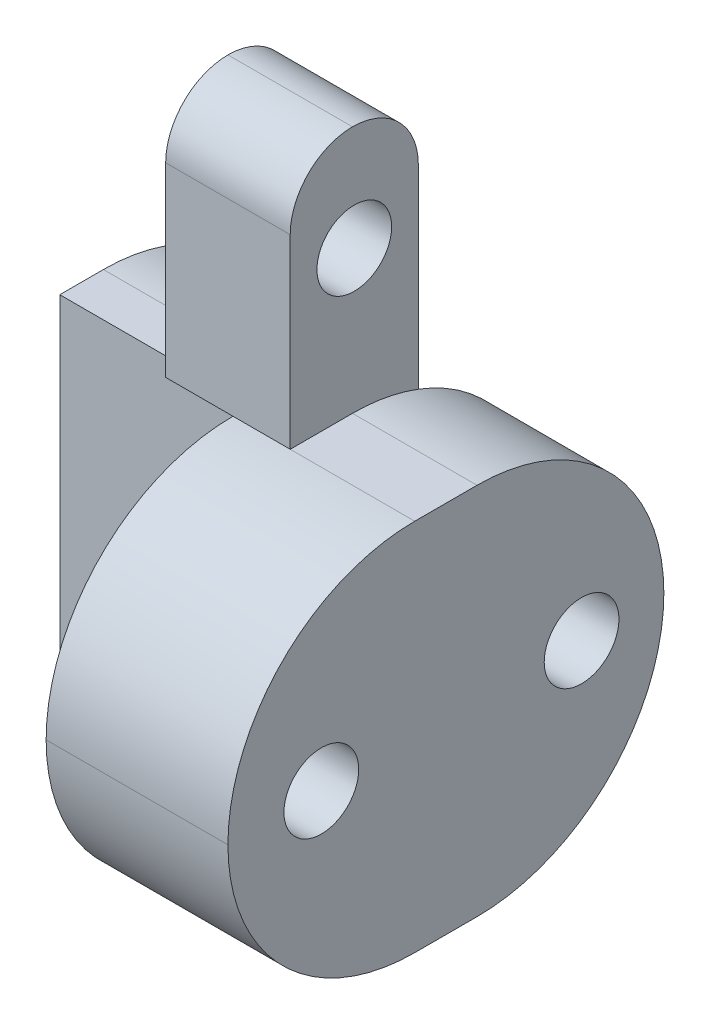
ISO-10303-21;
HEADER;
FILE_DESCRIPTION(('STEP AP214'),'2;1');
FILE_NAME('part.step','',(''),(''),'','','');
FILE_SCHEMA(('AUTOMOTIVE_DESIGN { 1 0 10303 214 1 1 1 1 }'));
ENDSEC;
DATA;
#1=APPLICATION_CONTEXT('core data for automotive mechanical design processes');
#2=APPLICATION_PROTOCOL_DEFINITION('international standard','automotive_design',2000,#1);
#3=PRODUCT_CONTEXT('',#1,'mechanical');
#4=PRODUCT('Part','Part','',(#3));
#5=PRODUCT_RELATED_PRODUCT_CATEGORY('part','',(#4));
#6=PRODUCT_DEFINITION_FORMATION('','',#4);
#7=PRODUCT_DEFINITION_CONTEXT('part definition',#1,'design');
#8=PRODUCT_DEFINITION('design','',#6,#7);
#9=PRODUCT_DEFINITION_SHAPE('','',#8);
#10=(LENGTH_UNIT() NAMED_UNIT(*) SI_UNIT(.MILLI.,.METRE.));
#11=(NAMED_UNIT(*) PLANE_ANGLE_UNIT() SI_UNIT($,.RADIAN.));
#12=(NAMED_UNIT(*) SI_UNIT($,.STERADIAN.) SOLID_ANGLE_UNIT());
#13=UNCERTAINTY_MEASURE_WITH_UNIT(LENGTH_MEASURE(1.E-05),#10,'distance_accuracy_value','');
#14=(GEOMETRIC_REPRESENTATION_CONTEXT(3) GLOBAL_UNCERTAINTY_ASSIGNED_CONTEXT((#13)) GLOBAL_UNIT_ASSIGNED_CONTEXT((#10,
#11,#12)) REPRESENTATION_CONTEXT('',''));
#15=CARTESIAN_POINT('',(0.,0.,0.));
#16=DIRECTION('',(0.,0.,1.));
#17=DIRECTION('',(1.,0.,0.));
#18=AXIS2_PLACEMENT_3D('',#15,#16,#17);
#19=CARTESIAN_POINT('',(0.,30.,0.));
#20=DIRECTION('',(0.,1.,0.));
#21=DIRECTION('',(0.,0.,1.));
#22=AXIS2_PLACEMENT_3D('',#19,#20,#21);
#23=PLANE('',#22);
#24=DIRECTION('',(-1.,0.,0.));
#25=VECTOR('',#24,1.);
#26=CARTESIAN_POINT('',(-0.00827647710685379,30.,-16.5));
#27=LINE('',#26,#25);
#28=CARTESIAN_POINT('',(-5.40449846696377,30.,-16.5));
#29=VERTEX_POINT('',#28);
#30=CARTESIAN_POINT('',(-15.4044984669638,30.,-16.5));
#31=VERTEX_POINT('',#30);
#32=EDGE_CURVE('E180',#29,#31,#27,.T.);
#33=ORIENTED_EDGE('',*,*,#32,.F.);
#34=DIRECTION('',(0.,0.,1.));
#35=VECTOR('',#34,1.);
#36=CARTESIAN_POINT('',(-5.40449846696377,30.,-25.2884975646309));
#37=LINE('',#36,#35);
#38=CARTESIAN_POINT('',(-5.40449846696377,30.,-20.));
#39=VERTEX_POINT('',#38);
#40=EDGE_CURVE('E219',#39,#29,#37,.T.);
#41=ORIENTED_EDGE('',*,*,#40,.F.);
#42=DIRECTION('',(-1.,0.,0.));
#43=VECTOR('',#42,1.);
#44=CARTESIAN_POINT('',(-15.4044984669638,30.,-20.));
#45=LINE('',#44,#43);
#46=CARTESIAN_POINT('',(-15.4044984669638,30.,-20.));
#47=VERTEX_POINT('',#46);
#48=EDGE_CURVE('E374',#39,#47,#45,.T.);
#49=ORIENTED_EDGE('',*,*,#48,.T.);
#50=DIRECTION('',(0.,0.,1.));
#51=VECTOR('',#50,1.);
#52=CARTESIAN_POINT('',(-15.4044984669638,30.,-35.));
#53=LINE('',#52,#51);
#54=EDGE_CURVE('E255',#47,#31,#53,.T.);
#55=ORIENTED_EDGE('',*,*,#54,.T.);
#56=EDGE_LOOP('',(#33,#41,#49,#55));
#57=FACE_BOUND('',#56,.T.);
#58=ADVANCED_FACE('F43',(#57),#23,.T.);
#59=DIRECTION('',(0.,0.,-1.));
#60=VECTOR('',#59,1.);
#61=CARTESIAN_POINT('',(14.5955015330362,30.,0.));
#62=LINE('',#61,#60);
#63=CARTESIAN_POINT('',(14.5955015330362,30.,-15.));
#64=VERTEX_POINT('',#63);
#65=CARTESIAN_POINT('',(14.5955015330362,30.,-20.));
#66=VERTEX_POINT('',#65);
#67=EDGE_CURVE('E251',#64,#66,#62,.T.);
#68=ORIENTED_EDGE('',*,*,#67,.T.);
#69=DIRECTION('',(-1.,0.,0.));
#70=VECTOR('',#69,1.);
#71=CARTESIAN_POINT('',(4.59550153303623,30.,-20.));
#72=LINE('',#71,#70);
#73=CARTESIAN_POINT('',(4.59550153303623,30.,-20.));
#74=VERTEX_POINT('',#73);
#75=EDGE_CURVE('E340',#66,#74,#72,.T.);
#76=ORIENTED_EDGE('',*,*,#75,.T.);
#77=DIRECTION('',(0.,0.,-1.));
#78=VECTOR('',#77,1.);
#79=CARTESIAN_POINT('',(4.59550153303623,30.,-15.));
#80=LINE('',#79,#78);
#81=CARTESIAN_POINT('',(4.59550153303623,30.,-15.));
#82=VERTEX_POINT('',#81);
#83=EDGE_CURVE('E222',#82,#74,#80,.T.);
#84=ORIENTED_EDGE('',*,*,#83,.F.);
#85=DIRECTION('',(1.,0.,0.));
#86=VECTOR('',#85,1.);
#87=CARTESIAN_POINT('',(14.5955015330362,30.,-15.));
#88=LINE('',#87,#86);
#89=EDGE_CURVE('E283',#82,#64,#88,.T.);
#90=ORIENTED_EDGE('',*,*,#89,.T.);
#91=EDGE_LOOP('',(#68,#76,#84,#90));
#92=FACE_BOUND('',#91,.T.);
#93=ADVANCED_FACE('F429',(#92),#23,.T.);
#94=CARTESIAN_POINT('',(0.,30.,-15.));
#95=DIRECTION('',(1.,0.,0.));
#96=DIRECTION('',(0.,0.,-1.));
#97=AXIS2_PLACEMENT_3D('',#94,#95,#96);
#98=PLANE('',#97);
#99=CARTESIAN_POINT('',(0.,15.,-7.5));
#100=DIRECTION('',(-1.,0.,0.));
#101=DIRECTION('',(0.,0.,1.));
#102=AXIS2_PLACEMENT_3D('',#99,#100,#101);
#103=CIRCLE('',#102,3.);
#104=CARTESIAN_POINT('',(0.,15.,-4.5));
#105=VERTEX_POINT('',#104);
#106=EDGE_CURVE('E246',#105,#105,#103,.T.);
#107=ORIENTED_EDGE('',*,*,#106,.F.);
#108=EDGE_LOOP('',(#107));
#109=FACE_BOUND('',#108,.T.);
#110=DIRECTION('',(0.,-1.,0.));
#111=VECTOR('',#110,1.);
#112=CARTESIAN_POINT('',(0.,30.,-15.));
#113=LINE('',#112,#111);
#114=CARTESIAN_POINT('',(0.,30.,-15.));
#115=VERTEX_POINT('',#114);
#116=CARTESIAN_POINT('',(0.,0.,-15.));
#117=VERTEX_POINT('',#116);
#118=EDGE_CURVE('E260',#115,#117,#113,.T.);
#119=ORIENTED_EDGE('',*,*,#118,.T.);
#120=CARTESIAN_POINT('',(0.,15.,-15.));
#121=DIRECTION('',(1.,0.,0.));
#122=DIRECTION('',(0.,0.,-1.));
#123=AXIS2_PLACEMENT_3D('',#120,#121,#122);
#124=CIRCLE('',#123,15.);
#125=CARTESIAN_POINT('',(0.,15.,0.));
#126=VERTEX_POINT('',#125);
#127=EDGE_CURVE('E309',#117,#126,#124,.F.);
#128=ORIENTED_EDGE('',*,*,#127,.T.);
#129=CARTESIAN_POINT('',(0.,15.,-15.));
#130=DIRECTION('',(1.,0.,0.));
#131=DIRECTION('',(0.,0.,-1.));
#132=AXIS2_PLACEMENT_3D('',#129,#130,#131);
#133=CIRCLE('',#132,15.);
#134=EDGE_CURVE('E299',#126,#115,#133,.F.);
#135=ORIENTED_EDGE('',*,*,#134,.T.);
#136=EDGE_LOOP('',(#119,#128,#135));
#137=FACE_BOUND('',#136,.T.);
#138=ADVANCED_FACE('F449',(#109,#137),#98,.F.);
#139=CARTESIAN_POINT('',(14.5955015330362,30.,0.));
#140=DIRECTION('',(-1.,0.,0.));
#141=DIRECTION('',(0.,0.,1.));
#142=AXIS2_PLACEMENT_3D('',#139,#140,#141);
#143=PLANE('',#142);
#144=CARTESIAN_POINT('',(14.5955015330362,15.,-28.3939454519953));
#145=DIRECTION('',(-1.,0.,0.));
#146=DIRECTION('',(0.,0.,1.));
#147=AXIS2_PLACEMENT_3D('',#144,#145,#146);
#148=CIRCLE('',#147,2.99999999999999);
#149=CARTESIAN_POINT('',(14.5955015330362,15.,-25.3939454519953));
#150=VERTEX_POINT('',#149);
#151=EDGE_CURVE('E242',#150,#150,#148,.F.);
#152=ORIENTED_EDGE('',*,*,#151,.F.);
#153=EDGE_LOOP('',(#152));
#154=FACE_BOUND('',#153,.T.);
#155=CARTESIAN_POINT('',(14.5955015330362,15.,-7.5));
#156=DIRECTION('',(-1.,0.,0.));
#157=DIRECTION('',(0.,0.,1.));
#158=AXIS2_PLACEMENT_3D('',#155,#156,#157);
#159=CIRCLE('',#158,3.);
#160=CARTESIAN_POINT('',(14.5955015330362,15.,-4.5));
#161=VERTEX_POINT('',#160);
#162=EDGE_CURVE('E250',#161,#161,#159,.T.);
#163=ORIENTED_EDGE('',*,*,#162,.T.);
#164=EDGE_LOOP('',(#163));
#165=FACE_BOUND('',#164,.T.);
#166=CARTESIAN_POINT('',(14.5955015330362,15.,-20.));
#167=DIRECTION('',(-1.,0.,0.));
#168=DIRECTION('',(0.,0.,1.));
#169=AXIS2_PLACEMENT_3D('',#166,#167,#168);
#170=CIRCLE('',#169,15.);
#171=CARTESIAN_POINT('',(14.5955015330362,0.,-20.));
#172=VERTEX_POINT('',#171);
#173=CARTESIAN_POINT('',(14.5955015330362,15.,-35.));
#174=VERTEX_POINT('',#173);
#175=EDGE_CURVE('E354',#172,#174,#170,.F.);
#176=ORIENTED_EDGE('',*,*,#175,.T.);
#177=CARTESIAN_POINT('',(14.5955015330362,15.,-20.));
#178=DIRECTION('',(-1.,0.,0.));
#179=DIRECTION('',(0.,0.,1.));
#180=AXIS2_PLACEMENT_3D('',#177,#178,#179);
#181=CIRCLE('',#180,15.);
#182=EDGE_CURVE('E357',#174,#66,#181,.F.);
#183=ORIENTED_EDGE('',*,*,#182,.T.);
#184=ORIENTED_EDGE('',*,*,#67,.F.);
#185=CARTESIAN_POINT('',(14.5955015330362,15.,-15.));
#186=DIRECTION('',(-1.,0.,0.));
#187=DIRECTION('',(0.,0.,1.));
#188=AXIS2_PLACEMENT_3D('',#185,#186,#187);
#189=CIRCLE('',#188,15.);
#190=CARTESIAN_POINT('',(14.5955015330362,15.,0.));
#191=VERTEX_POINT('',#190);
#192=EDGE_CURVE('E291',#64,#191,#189,.F.);
#193=ORIENTED_EDGE('',*,*,#192,.T.);
#194=CARTESIAN_POINT('',(14.5955015330362,15.,-15.));
#195=DIRECTION('',(-1.,0.,0.));
#196=DIRECTION('',(0.,0.,1.));
#197=AXIS2_PLACEMENT_3D('',#194,#195,#196);
#198=CIRCLE('',#197,15.);
#199=CARTESIAN_POINT('',(14.5955015330362,0.,-15.));
#200=VERTEX_POINT('',#199);
#201=EDGE_CURVE('E302',#191,#200,#198,.F.);
#202=ORIENTED_EDGE('',*,*,#201,.T.);
#203=DIRECTION('',(0.,0.,-1.));
#204=VECTOR('',#203,1.);
#205=CARTESIAN_POINT('',(14.5955015330362,0.,0.));
#206=LINE('',#205,#204);
#207=EDGE_CURVE('E261',#200,#172,#206,.T.);
#208=ORIENTED_EDGE('',*,*,#207,.T.);
#209=EDGE_LOOP('',(#176,#183,#184,#193,#202,#208));
#210=FACE_BOUND('',#209,.T.);
#211=ADVANCED_FACE('F427',(#154,#165,#210),#143,.F.);
#212=CARTESIAN_POINT('',(4.59550153303623,30.,-35.));
#213=DIRECTION('',(1.,0.,0.));
#214=DIRECTION('',(0.,0.,-1.));
#215=AXIS2_PLACEMENT_3D('',#212,#213,#214);
#216=PLANE('',#215);
#217=CARTESIAN_POINT('',(4.59550153303623,15.,-28.3939454519953));
#218=DIRECTION('',(1.,0.,0.));
#219=DIRECTION('',(0.,0.,-1.));
#220=AXIS2_PLACEMENT_3D('',#217,#218,#219);
#221=CIRCLE('',#220,2.99999999999999);
#222=CARTESIAN_POINT('',(4.59550153303623,15.,-31.3939454519952));
#223=VERTEX_POINT('',#222);
#224=EDGE_CURVE('E238',#223,#223,#221,.F.);
#225=ORIENTED_EDGE('',*,*,#224,.F.);
#226=EDGE_LOOP('',(#225));
#227=FACE_BOUND('',#226,.T.);
#228=DIRECTION('',(0.,-1.,0.));
#229=VECTOR('',#228,1.);
#230=CARTESIAN_POINT('',(4.59550153303623,30.,-25.2884975646309));
#231=LINE('',#230,#229);
#232=CARTESIAN_POINT('',(4.59550153303623,29.0368013987836,-25.2884975646309));
#233=VERTEX_POINT('',#232);
#234=CARTESIAN_POINT('',(4.59550153303623,0.963198601216408,-25.2884975646309));
#235=VERTEX_POINT('',#234);
#236=EDGE_CURVE('E278',#233,#235,#231,.T.);
#237=ORIENTED_EDGE('',*,*,#236,.F.);
#238=CARTESIAN_POINT('',(4.59550153303623,15.,-20.));
#239=DIRECTION('',(1.,0.,0.));
#240=DIRECTION('',(0.,0.,-1.));
#241=AXIS2_PLACEMENT_3D('',#238,#239,#240);
#242=CIRCLE('',#241,15.);
#243=CARTESIAN_POINT('',(4.59550153303623,15.,-35.));
#244=VERTEX_POINT('',#243);
#245=EDGE_CURVE('E351',#233,#244,#242,.F.);
#246=ORIENTED_EDGE('',*,*,#245,.T.);
#247=CARTESIAN_POINT('',(4.59550153303623,15.,-20.));
#248=DIRECTION('',(1.,0.,0.));
#249=DIRECTION('',(0.,0.,-1.));
#250=AXIS2_PLACEMENT_3D('',#247,#248,#249);
#251=CIRCLE('',#250,15.);
#252=EDGE_CURVE('E347',#244,#235,#251,.F.);
#253=ORIENTED_EDGE('',*,*,#252,.T.);
#254=EDGE_LOOP('',(#237,#246,#253));
#255=FACE_BOUND('',#254,.T.);
#256=ADVANCED_FACE('F423',(#227,#255),#216,.F.);
#257=CARTESIAN_POINT('',(4.59550153303623,30.,-25.2884975646309));
#258=DIRECTION('',(0.,0.,1.));
#259=DIRECTION('',(1.,0.,0.));
#260=AXIS2_PLACEMENT_3D('',#257,#258,#259);
#261=PLANE('',#260);
#262=ORIENTED_EDGE('',*,*,#236,.T.);
#263=DIRECTION('',(-1.,0.,0.));
#264=VECTOR('',#263,1.);
#265=CARTESIAN_POINT('',(4.59550153303623,0.963198601216414,-25.2884975646309));
#266=LINE('',#265,#264);
#267=CARTESIAN_POINT('',(-5.40449846696377,0.963198601216412,-25.2884975646309));
#268=VERTEX_POINT('',#267);
#269=EDGE_CURVE('E344',#235,#268,#266,.T.);
#270=ORIENTED_EDGE('',*,*,#269,.T.);
#271=DIRECTION('',(0.,-1.,0.));
#272=VECTOR('',#271,1.);
#273=CARTESIAN_POINT('',(-5.40449846696377,30.,-25.2884975646309));
#274=LINE('',#273,#272);
#275=CARTESIAN_POINT('',(-5.40449846696377,29.0368013987836,-25.2884975646309));
#276=VERTEX_POINT('',#275);
#277=EDGE_CURVE('E274',#276,#268,#274,.T.);
#278=ORIENTED_EDGE('',*,*,#277,.F.);
#279=CARTESIAN_POINT('',(-5.40449846696377,44.6238003674185,-25.2884975646309));
#280=VERTEX_POINT('',#279);
#281=EDGE_CURVE('E275',#280,#276,#274,.T.);
#282=ORIENTED_EDGE('',*,*,#281,.F.);
#283=DIRECTION('',(1.,0.,0.));
#284=VECTOR('',#283,1.);
#285=CARTESIAN_POINT('',(4.59550153303623,44.6238003674185,-25.2884975646309));
#286=LINE('',#285,#284);
#287=CARTESIAN_POINT('',(4.59550153303623,44.6238003674185,-25.2884975646309));
#288=VERTEX_POINT('',#287);
#289=EDGE_CURVE('E333',#280,#288,#286,.T.);
#290=ORIENTED_EDGE('',*,*,#289,.T.);
#291=EDGE_CURVE('E279',#288,#233,#231,.T.);
#292=ORIENTED_EDGE('',*,*,#291,.T.);
#293=EDGE_LOOP('',(#262,#270,#278,#282,#290,#292));
#294=FACE_BOUND('',#293,.T.);
#295=ADVANCED_FACE('F398',(#294),#261,.F.);
#296=CARTESIAN_POINT('',(-5.40449846696377,30.,-25.2884975646309));
#297=DIRECTION('',(-1.,0.,0.));
#298=DIRECTION('',(0.,0.,1.));
#299=AXIS2_PLACEMENT_3D('',#296,#297,#298);
#300=PLANE('',#299);
#301=CARTESIAN_POINT('',(-5.40449846696377,15.,-28.3939454519953));
#302=DIRECTION('',(-1.,0.,0.));
#303=DIRECTION('',(0.,0.,1.));
#304=AXIS2_PLACEMENT_3D('',#301,#302,#303);
#305=CIRCLE('',#304,2.99999999999999);
#306=CARTESIAN_POINT('',(-5.40449846696377,15.,-25.3939454519953));
#307=VERTEX_POINT('',#306);
#308=EDGE_CURVE('E234',#307,#307,#305,.F.);
#309=ORIENTED_EDGE('',*,*,#308,.F.);
#310=EDGE_LOOP('',(#309));
#311=FACE_BOUND('',#310,.T.);
#312=ORIENTED_EDGE('',*,*,#277,.T.);
#313=CARTESIAN_POINT('',(-5.40449846696377,15.,-20.));
#314=DIRECTION('',(-1.,0.,0.));
#315=DIRECTION('',(0.,0.,1.));
#316=AXIS2_PLACEMENT_3D('',#313,#314,#315);
#317=CIRCLE('',#316,15.);
#318=CARTESIAN_POINT('',(-5.40449846696377,15.,-35.));
#319=VERTEX_POINT('',#318);
#320=EDGE_CURVE('E67',#268,#319,#317,.F.);
#321=ORIENTED_EDGE('',*,*,#320,.T.);
#322=CARTESIAN_POINT('',(-5.40449846696377,15.,-20.));
#323=DIRECTION('',(-1.,0.,0.));
#324=DIRECTION('',(0.,0.,1.));
#325=AXIS2_PLACEMENT_3D('',#322,#323,#324);
#326=CIRCLE('',#325,15.);
#327=EDGE_CURVE('E369',#319,#276,#326,.F.);
#328=ORIENTED_EDGE('',*,*,#327,.T.);
#329=EDGE_LOOP('',(#312,#321,#328));
#330=FACE_BOUND('',#329,.T.);
#331=ADVANCED_FACE('F395',(#311,#330),#300,.F.);
#332=CARTESIAN_POINT('',(-15.4044984669638,30.,-35.));
#333=DIRECTION('',(1.,0.,0.));
#334=DIRECTION('',(0.,0.,-1.));
#335=AXIS2_PLACEMENT_3D('',#332,#333,#334);
#336=PLANE('',#335);
#337=CARTESIAN_POINT('',(-15.4044984669638,15.,-28.3939454519952));
#338=DIRECTION('',(1.,0.,0.));
#339=DIRECTION('',(0.,0.,-1.));
#340=AXIS2_PLACEMENT_3D('',#337,#338,#339);
#341=CIRCLE('',#340,2.99999999999999);
#342=CARTESIAN_POINT('',(-15.4044984669638,15.,-31.3939454519952));
#343=VERTEX_POINT('',#342);
#344=EDGE_CURVE('E233',#343,#343,#341,.F.);
#345=ORIENTED_EDGE('',*,*,#344,.F.);
#346=EDGE_LOOP('',(#345));
#347=FACE_BOUND('',#346,.T.);
#348=DIRECTION('',(0.,0.,1.));
#349=VECTOR('',#348,1.);
#350=CARTESIAN_POINT('',(-15.4044984669638,0.,-35.));
#351=LINE('',#350,#349);
#352=CARTESIAN_POINT('',(-15.4044984669638,0.,-20.));
#353=VERTEX_POINT('',#352);
#354=CARTESIAN_POINT('',(-15.4044984669638,0.,-16.5));
#355=VERTEX_POINT('',#354);
#356=EDGE_CURVE('E265',#353,#355,#351,.T.);
#357=ORIENTED_EDGE('',*,*,#356,.T.);
#358=DIRECTION('',(0.,-1.,0.));
#359=VECTOR('',#358,1.);
#360=CARTESIAN_POINT('',(-15.4044984669638,0.,-16.5));
#361=LINE('',#360,#359);
#362=EDGE_CURVE('E196',#31,#355,#361,.T.);
#363=ORIENTED_EDGE('',*,*,#362,.F.);
#364=ORIENTED_EDGE('',*,*,#54,.F.);
#365=CARTESIAN_POINT('',(-15.4044984669638,15.,-20.));
#366=DIRECTION('',(1.,0.,0.));
#367=DIRECTION('',(0.,0.,-1.));
#368=AXIS2_PLACEMENT_3D('',#365,#366,#367);
#369=CIRCLE('',#368,15.);
#370=CARTESIAN_POINT('',(-15.4044984669638,15.,-35.));
#371=VERTEX_POINT('',#370);
#372=EDGE_CURVE('E363',#47,#371,#369,.F.);
#373=ORIENTED_EDGE('',*,*,#372,.T.);
#374=CARTESIAN_POINT('',(-15.4044984669638,15.,-20.));
#375=DIRECTION('',(1.,0.,0.));
#376=DIRECTION('',(0.,0.,-1.));
#377=AXIS2_PLACEMENT_3D('',#374,#375,#376);
#378=CIRCLE('',#377,15.);
#379=EDGE_CURVE('E366',#371,#353,#378,.F.);
#380=ORIENTED_EDGE('',*,*,#379,.T.);
#381=EDGE_LOOP('',(#357,#363,#364,#373,#380));
#382=FACE_BOUND('',#381,.T.);
#383=ADVANCED_FACE('F453',(#347,#382),#336,.F.);
#384=CARTESIAN_POINT('',(-15.4044984669638,30.,-15.));
#385=DIRECTION('',(0.,0.,-1.));
#386=DIRECTION('',(-1.,0.,0.));
#387=AXIS2_PLACEMENT_3D('',#384,#385,#386);
#388=PLANE('',#387);
#389=DIRECTION('',(0.,-1.,0.));
#390=VECTOR('',#389,1.);
#391=CARTESIAN_POINT('',(-5.40449846696377,49.9237878857039,-15.));
#392=LINE('',#391,#390);
#393=CARTESIAN_POINT('',(-5.40449846696377,44.9237878857039,-15.));
#394=VERTEX_POINT('',#393);
#395=CARTESIAN_POINT('',(-5.40449846696377,30.,-15.));
#396=VERTEX_POINT('',#395);
#397=EDGE_CURVE('E229',#394,#396,#392,.T.);
#398=ORIENTED_EDGE('',*,*,#397,.T.);
#399=DIRECTION('',(-1.,0.,0.));
#400=VECTOR('',#399,1.);
#401=CARTESIAN_POINT('',(-0.00827647710685379,30.,-15.));
#402=LINE('',#401,#400);
#403=CARTESIAN_POINT('',(-0.00827647710685379,30.,-15.));
#404=VERTEX_POINT('',#403);
#405=EDGE_CURVE('E205',#404,#396,#402,.T.);
#406=ORIENTED_EDGE('',*,*,#405,.F.);
#407=DIRECTION('',(0.,1.,0.));
#408=VECTOR('',#407,1.);
#409=CARTESIAN_POINT('',(-0.00827647710685379,30.,-15.));
#410=LINE('',#409,#408);
#411=CARTESIAN_POINT('',(-0.00827647710685379,0.,-14.9999999999998));
#412=VERTEX_POINT('',#411);
#413=EDGE_CURVE('E193',#412,#404,#410,.T.);
#414=ORIENTED_EDGE('',*,*,#413,.F.);
#415=DIRECTION('',(1.,0.,0.));
#416=VECTOR('',#415,1.);
#417=CARTESIAN_POINT('',(-15.4044984669638,0.,-15.));
#418=LINE('',#417,#416);
#419=EDGE_CURVE('E256',#412,#117,#418,.T.);
#420=ORIENTED_EDGE('',*,*,#419,.T.);
#421=ORIENTED_EDGE('',*,*,#118,.F.);
#422=EDGE_CURVE('E287',#115,#82,#88,.T.);
#423=ORIENTED_EDGE('',*,*,#422,.T.);
#424=DIRECTION('',(0.,-1.,0.));
#425=VECTOR('',#424,1.);
#426=CARTESIAN_POINT('',(4.59550153303623,49.9237878857039,-15.));
#427=LINE('',#426,#425);
#428=CARTESIAN_POINT('',(4.59550153303623,44.9237878857039,-15.));
#429=VERTEX_POINT('',#428);
#430=EDGE_CURVE('E226',#429,#82,#427,.T.);
#431=ORIENTED_EDGE('',*,*,#430,.F.);
#432=DIRECTION('',(1.,0.,0.));
#433=VECTOR('',#432,1.);
#434=CARTESIAN_POINT('',(-5.40449846696377,44.9237878857039,-15.));
#435=LINE('',#434,#433);
#436=EDGE_CURVE('E322',#429,#394,#435,.F.);
#437=ORIENTED_EDGE('',*,*,#436,.T.);
#438=EDGE_LOOP('',(#398,#406,#414,#420,#421,#423,#431,#437));
#439=FACE_BOUND('',#438,.T.);
#440=ADVANCED_FACE('F406',(#439),#388,.F.);
#441=CARTESIAN_POINT('',(0.,0.,0.));
#442=DIRECTION('',(0.,1.,0.));
#443=DIRECTION('',(0.,0.,1.));
#444=AXIS2_PLACEMENT_3D('',#441,#442,#443);
#445=PLANE('',#444);
#446=DIRECTION('',(0.,0.,1.));
#447=VECTOR('',#446,1.);
#448=CARTESIAN_POINT('',(-0.00827647710685379,0.,-14.9999999999998));
#449=LINE('',#448,#447);
#450=CARTESIAN_POINT('',(-0.00827647710685379,0.,-16.5));
#451=VERTEX_POINT('',#450);
#452=EDGE_CURVE('E189',#451,#412,#449,.T.);
#453=ORIENTED_EDGE('',*,*,#452,.F.);
#454=DIRECTION('',(-1.,0.,0.));
#455=VECTOR('',#454,1.);
#456=CARTESIAN_POINT('',(-0.00827647710685379,0.,-16.5));
#457=LINE('',#456,#455);
#458=EDGE_CURVE('E179',#451,#355,#457,.T.);
#459=ORIENTED_EDGE('',*,*,#458,.T.);
#460=ORIENTED_EDGE('',*,*,#356,.F.);
#461=DIRECTION('',(-1.,0.,0.));
#462=VECTOR('',#461,1.);
#463=CARTESIAN_POINT('',(0.,0.,-20.));
#464=LINE('',#463,#462);
#465=EDGE_CURVE('E360',#353,#172,#464,.F.);
#466=ORIENTED_EDGE('',*,*,#465,.T.);
#467=ORIENTED_EDGE('',*,*,#207,.F.);
#468=DIRECTION('',(1.,0.,0.));
#469=VECTOR('',#468,1.);
#470=CARTESIAN_POINT('',(0.,0.,-15.));
#471=LINE('',#470,#469);
#472=EDGE_CURVE('E305',#200,#117,#471,.F.);
#473=ORIENTED_EDGE('',*,*,#472,.T.);
#474=ORIENTED_EDGE('',*,*,#419,.F.);
#475=EDGE_LOOP('',(#453,#459,#460,#466,#467,#473,#474));
#476=FACE_BOUND('',#475,.T.);
#477=ADVANCED_FACE('F443',(#476),#445,.F.);
#478=CARTESIAN_POINT('',(30.,15.,-7.5));
#479=DIRECTION('',(-1.,0.,0.));
#480=DIRECTION('',(0.,0.,1.));
#481=AXIS2_PLACEMENT_3D('',#478,#479,#480);
#482=CYLINDRICAL_SURFACE('',#481,3.);
#483=ORIENTED_EDGE('',*,*,#106,.T.);
#484=EDGE_LOOP('',(#483));
#485=FACE_BOUND('',#484,.T.);
#486=ORIENTED_EDGE('',*,*,#162,.F.);
#487=EDGE_LOOP('',(#486));
#488=FACE_BOUND('',#487,.T.);
#489=ADVANCED_FACE('F464',(#485,#488),#482,.F.);
#490=CARTESIAN_POINT('',(0.,15.,-15.));
#491=DIRECTION('',(-1.,0.,0.));
#492=DIRECTION('',(0.,0.,1.));
#493=AXIS2_PLACEMENT_3D('',#490,#491,#492);
#494=CYLINDRICAL_SURFACE('',#493,15.);
#495=ORIENTED_EDGE('',*,*,#134,.F.);
#496=DIRECTION('',(1.,0.,0.));
#497=VECTOR('',#496,1.);
#498=CARTESIAN_POINT('',(0.,15.,0.));
#499=LINE('',#498,#497);
#500=EDGE_CURVE('E295',#191,#126,#499,.F.);
#501=ORIENTED_EDGE('',*,*,#500,.F.);
#502=ORIENTED_EDGE('',*,*,#192,.F.);
#503=ORIENTED_EDGE('',*,*,#89,.F.);
#504=ORIENTED_EDGE('',*,*,#422,.F.);
#505=EDGE_LOOP('',(#495,#501,#502,#503,#504));
#506=FACE_BOUND('',#505,.T.);
#507=ADVANCED_FACE('F438',(#506),#494,.T.);
#508=CARTESIAN_POINT('',(0.,15.,-15.));
#509=DIRECTION('',(1.,0.,0.));
#510=DIRECTION('',(0.,0.,-1.));
#511=AXIS2_PLACEMENT_3D('',#508,#509,#510);
#512=CYLINDRICAL_SURFACE('',#511,15.);
#513=ORIENTED_EDGE('',*,*,#127,.F.);
#514=ORIENTED_EDGE('',*,*,#472,.F.);
#515=ORIENTED_EDGE('',*,*,#201,.F.);
#516=ORIENTED_EDGE('',*,*,#500,.T.);
#517=EDGE_LOOP('',(#513,#514,#515,#516));
#518=FACE_BOUND('',#517,.T.);
#519=ADVANCED_FACE('F447',(#518),#512,.T.);
#520=CARTESIAN_POINT('',(-25.4044984669638,15.,-28.3939454519952));
#521=DIRECTION('',(1.,0.,0.));
#522=DIRECTION('',(0.,0.,-1.));
#523=AXIS2_PLACEMENT_3D('',#520,#521,#522);
#524=CYLINDRICAL_SURFACE('',#523,2.99999999999999);
#525=ORIENTED_EDGE('',*,*,#344,.T.);
#526=EDGE_LOOP('',(#525));
#527=FACE_BOUND('',#526,.T.);
#528=ORIENTED_EDGE('',*,*,#308,.T.);
#529=EDGE_LOOP('',(#528));
#530=FACE_BOUND('',#529,.T.);
#531=ADVANCED_FACE('F491',(#527,#530),#524,.F.);
#532=ORIENTED_EDGE('',*,*,#224,.T.);
#533=EDGE_LOOP('',(#532));
#534=FACE_BOUND('',#533,.T.);
#535=ORIENTED_EDGE('',*,*,#151,.T.);
#536=EDGE_LOOP('',(#535));
#537=FACE_BOUND('',#536,.T.);
#538=ADVANCED_FACE('F536',(#534,#537),#524,.F.);
#539=CARTESIAN_POINT('',(-5.40449846696377,49.9237878857039,-25.2884975646309));
#540=DIRECTION('',(1.,0.,0.));
#541=DIRECTION('',(0.,0.,-1.));
#542=AXIS2_PLACEMENT_3D('',#539,#540,#541);
#543=PLANE('',#542);
#544=CARTESIAN_POINT('',(-5.40449846696377,41.4145416305683,-20.1442487823155));
#545=DIRECTION('',(1.,0.,0.));
#546=DIRECTION('',(0.,0.,-1.));
#547=AXIS2_PLACEMENT_3D('',#544,#545,#546);
#548=CIRCLE('',#547,3.);
#549=CARTESIAN_POINT('',(-5.40449846696377,41.4145416305683,-23.1442487823155));
#550=VERTEX_POINT('',#549);
#551=EDGE_CURVE('E211',#550,#550,#548,.T.);
#552=ORIENTED_EDGE('',*,*,#551,.T.);
#553=EDGE_LOOP('',(#552));
#554=FACE_BOUND('',#553,.T.);
#555=CARTESIAN_POINT('',(-5.40449846696377,44.9237878857039,-20.));
#556=DIRECTION('',(1.,0.,0.));
#557=DIRECTION('',(0.,0.,-1.));
#558=AXIS2_PLACEMENT_3D('',#555,#556,#557);
#559=CIRCLE('',#558,5.);
#560=CARTESIAN_POINT('',(-5.40449846696377,49.9237878857039,-20.));
#561=VERTEX_POINT('',#560);
#562=EDGE_CURVE('E325',#394,#561,#559,.F.);
#563=ORIENTED_EDGE('',*,*,#562,.T.);
#564=CARTESIAN_POINT('',(-5.40449846696377,44.6238003674185,-19.9884975646309));
#565=DIRECTION('',(1.,0.,0.));
#566=DIRECTION('',(0.,0.,-1.));
#567=AXIS2_PLACEMENT_3D('',#564,#565,#566);
#568=CIRCLE('',#567,5.3);
#569=EDGE_CURVE('E329',#561,#280,#568,.F.);
#570=ORIENTED_EDGE('',*,*,#569,.T.);
#571=ORIENTED_EDGE('',*,*,#281,.T.);
#572=CARTESIAN_POINT('',(-5.40449846696377,15.,-20.));
#573=DIRECTION('',(1.,0.,0.));
#574=DIRECTION('',(0.,0.,-1.));
#575=AXIS2_PLACEMENT_3D('',#572,#573,#574);
#576=CIRCLE('',#575,15.);
#577=EDGE_CURVE('E11',#276,#39,#576,.T.);
#578=ORIENTED_EDGE('',*,*,#577,.T.);
#579=ORIENTED_EDGE('',*,*,#40,.T.);
#580=EDGE_CURVE('E175',#29,#396,#37,.T.);
#581=ORIENTED_EDGE('',*,*,#580,.T.);
#582=ORIENTED_EDGE('',*,*,#397,.F.);
#583=EDGE_LOOP('',(#563,#570,#571,#578,#579,#581,#582));
#584=FACE_BOUND('',#583,.T.);
#585=ADVANCED_FACE('F403',(#554,#584),#543,.F.);
#586=CARTESIAN_POINT('',(4.59550153303623,49.9237878857039,-15.));
#587=DIRECTION('',(-1.,0.,0.));
#588=DIRECTION('',(0.,0.,1.));
#589=AXIS2_PLACEMENT_3D('',#586,#587,#588);
#590=PLANE('',#589);
#591=CARTESIAN_POINT('',(4.59550153303623,41.4145416305683,-20.1442487823155));
#592=DIRECTION('',(1.,0.,0.));
#593=DIRECTION('',(0.,0.,-1.));
#594=AXIS2_PLACEMENT_3D('',#591,#592,#593);
#595=CIRCLE('',#594,3.);
#596=CARTESIAN_POINT('',(4.59550153303623,41.4145416305683,-23.1442487823155));
#597=VERTEX_POINT('',#596);
#598=EDGE_CURVE('E215',#597,#597,#595,.T.);
#599=ORIENTED_EDGE('',*,*,#598,.F.);
#600=EDGE_LOOP('',(#599));
#601=FACE_BOUND('',#600,.T.);
#602=ORIENTED_EDGE('',*,*,#291,.F.);
#603=CARTESIAN_POINT('',(4.59550153303623,44.6238003674185,-19.9884975646309));
#604=DIRECTION('',(-1.,0.,0.));
#605=DIRECTION('',(0.,0.,1.));
#606=AXIS2_PLACEMENT_3D('',#603,#604,#605);
#607=CIRCLE('',#606,5.3);
#608=CARTESIAN_POINT('',(4.59550153303623,49.9237878857039,-20.));
#609=VERTEX_POINT('',#608);
#610=EDGE_CURVE('E337',#288,#609,#607,.F.);
#611=ORIENTED_EDGE('',*,*,#610,.T.);
#612=CARTESIAN_POINT('',(4.59550153303623,44.9237878857039,-20.));
#613=DIRECTION('',(-1.,0.,0.));
#614=DIRECTION('',(0.,0.,1.));
#615=AXIS2_PLACEMENT_3D('',#612,#613,#614);
#616=CIRCLE('',#615,5.);
#617=EDGE_CURVE('E319',#609,#429,#616,.F.);
#618=ORIENTED_EDGE('',*,*,#617,.T.);
#619=ORIENTED_EDGE('',*,*,#430,.T.);
#620=ORIENTED_EDGE('',*,*,#83,.T.);
#621=CARTESIAN_POINT('',(4.59550153303623,15.,-20.));
#622=DIRECTION('',(-1.,0.,0.));
#623=DIRECTION('',(0.,0.,1.));
#624=AXIS2_PLACEMENT_3D('',#621,#622,#623);
#625=CIRCLE('',#624,15.);
#626=EDGE_CURVE('E53',#74,#233,#625,.T.);
#627=ORIENTED_EDGE('',*,*,#626,.T.);
#628=EDGE_LOOP('',(#602,#611,#618,#619,#620,#627));
#629=FACE_BOUND('',#628,.T.);
#630=ADVANCED_FACE('F520',(#601,#629),#590,.F.);
#631=CARTESIAN_POINT('',(-5.40449846696377,41.4145416305683,-20.1442487823155));
#632=DIRECTION('',(1.,0.,0.));
#633=DIRECTION('',(0.,0.,-1.));
#634=AXIS2_PLACEMENT_3D('',#631,#632,#633);
#635=CYLINDRICAL_SURFACE('',#634,3.);
#636=ORIENTED_EDGE('',*,*,#551,.F.);
#637=EDGE_LOOP('',(#636));
#638=FACE_BOUND('',#637,.T.);
#639=ORIENTED_EDGE('',*,*,#598,.T.);
#640=EDGE_LOOP('',(#639));
#641=FACE_BOUND('',#640,.T.);
#642=ADVANCED_FACE('F494',(#638,#641),#635,.F.);
#643=CARTESIAN_POINT('',(0.,44.9237878857039,-20.));
#644=DIRECTION('',(-1.,0.,0.));
#645=DIRECTION('',(0.,0.,1.));
#646=AXIS2_PLACEMENT_3D('',#643,#644,#645);
#647=CYLINDRICAL_SURFACE('',#646,5.);
#648=ORIENTED_EDGE('',*,*,#562,.F.);
#649=ORIENTED_EDGE('',*,*,#436,.F.);
#650=ORIENTED_EDGE('',*,*,#617,.F.);
#651=DIRECTION('',(1.,0.,0.));
#652=VECTOR('',#651,1.);
#653=CARTESIAN_POINT('',(4.59550153303623,49.9237878857039,-20.));
#654=LINE('',#653,#652);
#655=EDGE_CURVE('E312',#561,#609,#654,.T.);
#656=ORIENTED_EDGE('',*,*,#655,.F.);
#657=EDGE_LOOP('',(#648,#649,#650,#656));
#658=FACE_BOUND('',#657,.T.);
#659=ADVANCED_FACE('F411',(#658),#647,.T.);
#660=CARTESIAN_POINT('',(0.,44.6238003674185,-19.9884975646309));
#661=DIRECTION('',(1.,0.,0.));
#662=DIRECTION('',(0.,0.,-1.));
#663=AXIS2_PLACEMENT_3D('',#660,#661,#662);
#664=CYLINDRICAL_SURFACE('',#663,5.3);
#665=ORIENTED_EDGE('',*,*,#610,.F.);
#666=ORIENTED_EDGE('',*,*,#289,.F.);
#667=ORIENTED_EDGE('',*,*,#569,.F.);
#668=ORIENTED_EDGE('',*,*,#655,.T.);
#669=EDGE_LOOP('',(#665,#666,#667,#668));
#670=FACE_BOUND('',#669,.T.);
#671=ADVANCED_FACE('F416',(#670),#664,.T.);
#672=CARTESIAN_POINT('',(0.,15.,-20.));
#673=DIRECTION('',(1.,0.,0.));
#674=DIRECTION('',(0.,0.,-1.));
#675=AXIS2_PLACEMENT_3D('',#672,#673,#674);
#676=CYLINDRICAL_SURFACE('',#675,15.);
#677=ORIENTED_EDGE('',*,*,#577,.F.);
#678=ORIENTED_EDGE('',*,*,#327,.F.);
#679=DIRECTION('',(-1.,0.,0.));
#680=VECTOR('',#679,1.);
#681=CARTESIAN_POINT('',(-5.40449846696377,15.,-35.));
#682=LINE('',#681,#680);
#683=EDGE_CURVE('E47',#371,#319,#682,.F.);
#684=ORIENTED_EDGE('',*,*,#683,.F.);
#685=ORIENTED_EDGE('',*,*,#372,.F.);
#686=ORIENTED_EDGE('',*,*,#48,.F.);
#687=EDGE_LOOP('',(#677,#678,#684,#685,#686));
#688=FACE_BOUND('',#687,.T.);
#689=ADVANCED_FACE('F45',(#688),#676,.T.);
#690=CARTESIAN_POINT('',(-5.40449846696378,15.,-20.));
#691=DIRECTION('',(-1.,0.,0.));
#692=DIRECTION('',(0.,0.,1.));
#693=AXIS2_PLACEMENT_3D('',#690,#691,#692);
#694=CYLINDRICAL_SURFACE('',#693,15.);
#695=ORIENTED_EDGE('',*,*,#320,.F.);
#696=ORIENTED_EDGE('',*,*,#269,.F.);
#697=ORIENTED_EDGE('',*,*,#252,.F.);
#698=DIRECTION('',(-1.,0.,0.));
#699=VECTOR('',#698,1.);
#700=CARTESIAN_POINT('',(14.5955015330362,15.,-35.));
#701=LINE('',#700,#699);
#702=EDGE_CURVE('E208',#174,#244,#701,.T.);
#703=ORIENTED_EDGE('',*,*,#702,.F.);
#704=ORIENTED_EDGE('',*,*,#175,.F.);
#705=ORIENTED_EDGE('',*,*,#465,.F.);
#706=ORIENTED_EDGE('',*,*,#379,.F.);
#707=ORIENTED_EDGE('',*,*,#683,.T.);
#708=EDGE_LOOP('',(#695,#696,#697,#703,#704,#705,#706,#707));
#709=FACE_BOUND('',#708,.T.);
#710=ADVANCED_FACE('F389',(#709),#694,.T.);
#711=CARTESIAN_POINT('',(0.,15.,-20.));
#712=DIRECTION('',(1.,0.,0.));
#713=DIRECTION('',(0.,0.,-1.));
#714=AXIS2_PLACEMENT_3D('',#711,#712,#713);
#715=CYLINDRICAL_SURFACE('',#714,15.);
#716=ORIENTED_EDGE('',*,*,#182,.F.);
#717=ORIENTED_EDGE('',*,*,#702,.T.);
#718=ORIENTED_EDGE('',*,*,#245,.F.);
#719=ORIENTED_EDGE('',*,*,#626,.F.);
#720=ORIENTED_EDGE('',*,*,#75,.F.);
#721=EDGE_LOOP('',(#716,#717,#718,#719,#720));
#722=FACE_BOUND('',#721,.T.);
#723=ADVANCED_FACE('F419',(#722),#715,.T.);
#724=CARTESIAN_POINT('',(-0.00827647710685379,30.,-16.5));
#725=DIRECTION('',(0.,1.,0.));
#726=DIRECTION('',(0.,0.,1.));
#727=AXIS2_PLACEMENT_3D('',#724,#725,#726);
#728=PLANE('',#727);
#729=CARTESIAN_POINT('',(-0.00827647710685379,30.,-16.5));
#730=VERTEX_POINT('',#729);
#731=EDGE_CURVE('E168',#730,#29,#27,.T.);
#732=ORIENTED_EDGE('',*,*,#731,.F.);
#733=DIRECTION('',(0.,0.,-1.));
#734=VECTOR('',#733,1.);
#735=CARTESIAN_POINT('',(-0.00827647710685379,30.,-16.5));
#736=LINE('',#735,#734);
#737=EDGE_CURVE('E172',#404,#730,#736,.T.);
#738=ORIENTED_EDGE('',*,*,#737,.F.);
#739=ORIENTED_EDGE('',*,*,#405,.T.);
#740=ORIENTED_EDGE('',*,*,#580,.F.);
#741=EDGE_LOOP('',(#732,#738,#739,#740));
#742=FACE_BOUND('',#741,.T.);
#743=ADVANCED_FACE('F170',(#742),#728,.F.);
#744=CARTESIAN_POINT('',(-0.00827647710685379,0.,-16.5));
#745=DIRECTION('',(0.,0.,-1.));
#746=DIRECTION('',(-1.,0.,0.));
#747=AXIS2_PLACEMENT_3D('',#744,#745,#746);
#748=PLANE('',#747);
#749=ORIENTED_EDGE('',*,*,#362,.T.);
#750=ORIENTED_EDGE('',*,*,#458,.F.);
#751=DIRECTION('',(0.,-1.,0.));
#752=VECTOR('',#751,1.);
#753=CARTESIAN_POINT('',(-0.00827647710685379,0.,-16.5));
#754=LINE('',#753,#752);
#755=EDGE_CURVE('E183',#730,#451,#754,.T.);
#756=ORIENTED_EDGE('',*,*,#755,.F.);
#757=ORIENTED_EDGE('',*,*,#731,.T.);
#758=ORIENTED_EDGE('',*,*,#32,.T.);
#759=EDGE_LOOP('',(#749,#750,#756,#757,#758));
#760=FACE_BOUND('',#759,.T.);
#761=ADVANCED_FACE('F184',(#760),#748,.F.);
#762=CARTESIAN_POINT('',(-0.00827647710685379,0.,0.));
#763=DIRECTION('',(1.,0.,0.));
#764=DIRECTION('',(0.,0.,-1.));
#765=AXIS2_PLACEMENT_3D('',#762,#763,#764);
#766=PLANE('',#765);
#767=ORIENTED_EDGE('',*,*,#737,.T.);
#768=ORIENTED_EDGE('',*,*,#755,.T.);
#769=ORIENTED_EDGE('',*,*,#452,.T.);
#770=ORIENTED_EDGE('',*,*,#413,.T.);
#771=EDGE_LOOP('',(#767,#768,#769,#770));
#772=FACE_BOUND('',#771,.T.);
#773=ADVANCED_FACE('F191',(#772),#766,.F.);
#774=CLOSED_SHELL('',(#58,#93,#138,#211,#256,#295,#331,#383,#440,#477,#489,#507,#519,#531,#538,
#585,#630,#642,#659,#671,#689,#710,#723,#743,#761,#773));
#775=MANIFOLD_SOLID_BREP('B2',#774);
#776=ADVANCED_BREP_SHAPE_REPRESENTATION('',(#18,#775),#14);
#777=SHAPE_DEFINITION_REPRESENTATION(#9,#776);
ENDSEC;
END-ISO-10303-21;
